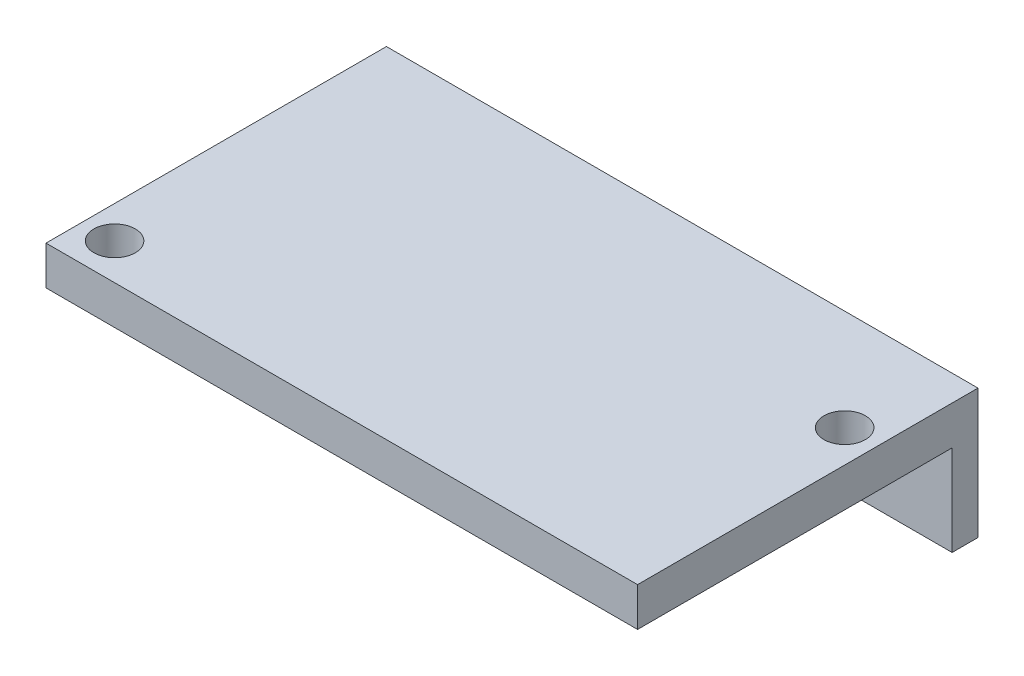
ISO-10303-21;
HEADER;
FILE_DESCRIPTION(('STEP AP214'),'2;1');
FILE_NAME('part.step','',(''),(''),'','','');
FILE_SCHEMA(('AUTOMOTIVE_DESIGN { 1 0 10303 214 1 1 1 1 }'));
ENDSEC;
DATA;
#1=APPLICATION_CONTEXT('core data for automotive mechanical design processes');
#2=APPLICATION_PROTOCOL_DEFINITION('international standard','automotive_design',2000,#1);
#3=PRODUCT_CONTEXT('',#1,'mechanical');
#4=PRODUCT('Part','Part','',(#3));
#5=PRODUCT_RELATED_PRODUCT_CATEGORY('part','',(#4));
#6=PRODUCT_DEFINITION_FORMATION('','',#4);
#7=PRODUCT_DEFINITION_CONTEXT('part definition',#1,'design');
#8=PRODUCT_DEFINITION('design','',#6,#7);
#9=PRODUCT_DEFINITION_SHAPE('','',#8);
#10=(LENGTH_UNIT() NAMED_UNIT(*) SI_UNIT(.MILLI.,.METRE.));
#11=(NAMED_UNIT(*) PLANE_ANGLE_UNIT() SI_UNIT($,.RADIAN.));
#12=(NAMED_UNIT(*) SI_UNIT($,.STERADIAN.) SOLID_ANGLE_UNIT());
#13=UNCERTAINTY_MEASURE_WITH_UNIT(LENGTH_MEASURE(1.E-05),#10,'distance_accuracy_value','');
#14=(GEOMETRIC_REPRESENTATION_CONTEXT(3) GLOBAL_UNCERTAINTY_ASSIGNED_CONTEXT((#13)) GLOBAL_UNIT_ASSIGNED_CONTEXT((#10,
#11,#12)) REPRESENTATION_CONTEXT('',''));
#15=CARTESIAN_POINT('',(0.,0.,0.));
#16=DIRECTION('',(0.,0.,1.));
#17=DIRECTION('',(1.,0.,0.));
#18=AXIS2_PLACEMENT_3D('',#15,#16,#17);
#19=CARTESIAN_POINT('',(22.85,3.,12.15));
#20=DIRECTION('',(-1.,0.,0.));
#21=DIRECTION('',(0.,0.,1.));
#22=AXIS2_PLACEMENT_3D('',#19,#20,#21);
#23=PLANE('',#22);
#24=DIRECTION('',(0.,0.,-1.));
#25=VECTOR('',#24,1.);
#26=CARTESIAN_POINT('',(22.85,0.,12.15));
#27=LINE('',#26,#25);
#28=CARTESIAN_POINT('',(22.85,0.,12.15));
#29=VERTEX_POINT('',#28);
#30=CARTESIAN_POINT('',(22.85,0.,-12.15));
#31=VERTEX_POINT('',#30);
#32=EDGE_CURVE('E94',#29,#31,#27,.T.);
#33=ORIENTED_EDGE('',*,*,#32,.T.);
#34=DIRECTION('',(0.,1.,0.));
#35=VECTOR('',#34,1.);
#36=CARTESIAN_POINT('',(22.85,-7.,-12.15));
#37=LINE('',#36,#35);
#38=CARTESIAN_POINT('',(22.85,-7.,-12.15));
#39=VERTEX_POINT('',#38);
#40=EDGE_CURVE('E126',#39,#31,#37,.T.);
#41=ORIENTED_EDGE('',*,*,#40,.F.);
#42=DIRECTION('',(0.,0.,-1.));
#43=VECTOR('',#42,1.);
#44=CARTESIAN_POINT('',(22.85,-7.,-14.15));
#45=LINE('',#44,#43);
#46=CARTESIAN_POINT('',(22.85,-7.,-14.15));
#47=VERTEX_POINT('',#46);
#48=EDGE_CURVE('E206',#39,#47,#45,.T.);
#49=ORIENTED_EDGE('',*,*,#48,.T.);
#50=DIRECTION('',(0.,1.,0.));
#51=VECTOR('',#50,1.);
#52=CARTESIAN_POINT('',(22.85,-7.,-14.15));
#53=LINE('',#52,#51);
#54=CARTESIAN_POINT('',(22.85,3.,-14.15));
#55=VERTEX_POINT('',#54);
#56=EDGE_CURVE('E129',#47,#55,#53,.T.);
#57=ORIENTED_EDGE('',*,*,#56,.T.);
#58=DIRECTION('',(0.,0.,-1.));
#59=VECTOR('',#58,1.);
#60=CARTESIAN_POINT('',(22.85,3.,12.15));
#61=LINE('',#60,#59);
#62=CARTESIAN_POINT('',(22.85,3.,12.15));
#63=VERTEX_POINT('',#62);
#64=EDGE_CURVE('E89',#63,#55,#61,.T.);
#65=ORIENTED_EDGE('',*,*,#64,.F.);
#66=DIRECTION('',(0.,-1.,0.));
#67=VECTOR('',#66,1.);
#68=CARTESIAN_POINT('',(22.85,3.,12.15));
#69=LINE('',#68,#67);
#70=EDGE_CURVE('E55',#63,#29,#69,.T.);
#71=ORIENTED_EDGE('',*,*,#70,.T.);
#72=EDGE_LOOP('',(#33,#41,#49,#57,#65,#71));
#73=FACE_BOUND('',#72,.T.);
#74=ADVANCED_FACE('F45',(#73),#23,.F.);
#75=CARTESIAN_POINT('',(-22.85,3.,12.15));
#76=DIRECTION('',(1.,0.,0.));
#77=DIRECTION('',(0.,0.,-1.));
#78=AXIS2_PLACEMENT_3D('',#75,#76,#77);
#79=PLANE('',#78);
#80=DIRECTION('',(0.,0.,1.));
#81=VECTOR('',#80,1.);
#82=CARTESIAN_POINT('',(-22.85,0.,12.15));
#83=LINE('',#82,#81);
#84=CARTESIAN_POINT('',(-22.85,0.,-12.15));
#85=VERTEX_POINT('',#84);
#86=CARTESIAN_POINT('',(-22.85,0.,12.15));
#87=VERTEX_POINT('',#86);
#88=EDGE_CURVE('E78',#85,#87,#83,.T.);
#89=ORIENTED_EDGE('',*,*,#88,.T.);
#90=DIRECTION('',(0.,-1.,0.));
#91=VECTOR('',#90,1.);
#92=CARTESIAN_POINT('',(-22.85,3.,12.15));
#93=LINE('',#92,#91);
#94=CARTESIAN_POINT('',(-22.85,3.,12.15));
#95=VERTEX_POINT('',#94);
#96=EDGE_CURVE('E11',#95,#87,#93,.T.);
#97=ORIENTED_EDGE('',*,*,#96,.F.);
#98=DIRECTION('',(0.,0.,1.));
#99=VECTOR('',#98,1.);
#100=CARTESIAN_POINT('',(-22.85,3.,12.15));
#101=LINE('',#100,#99);
#102=CARTESIAN_POINT('',(-22.85,3.,-14.15));
#103=VERTEX_POINT('',#102);
#104=EDGE_CURVE('E133',#103,#95,#101,.T.);
#105=ORIENTED_EDGE('',*,*,#104,.F.);
#106=DIRECTION('',(0.,1.,0.));
#107=VECTOR('',#106,1.);
#108=CARTESIAN_POINT('',(-22.85,-7.,-14.15));
#109=LINE('',#108,#107);
#110=CARTESIAN_POINT('',(-22.85,-7.,-14.15));
#111=VERTEX_POINT('',#110);
#112=EDGE_CURVE('E228',#111,#103,#109,.T.);
#113=ORIENTED_EDGE('',*,*,#112,.F.);
#114=DIRECTION('',(0.,0.,1.));
#115=VECTOR('',#114,1.);
#116=CARTESIAN_POINT('',(-22.85,-7.,-14.15));
#117=LINE('',#116,#115);
#118=CARTESIAN_POINT('',(-22.85,-7.,-12.15));
#119=VERTEX_POINT('',#118);
#120=EDGE_CURVE('E214',#111,#119,#117,.T.);
#121=ORIENTED_EDGE('',*,*,#120,.T.);
#122=DIRECTION('',(0.,1.,0.));
#123=VECTOR('',#122,1.);
#124=CARTESIAN_POINT('',(-22.85,-7.,-12.15));
#125=LINE('',#124,#123);
#126=EDGE_CURVE('E226',#119,#85,#125,.T.);
#127=ORIENTED_EDGE('',*,*,#126,.T.);
#128=EDGE_LOOP('',(#89,#97,#105,#113,#121,#127));
#129=FACE_BOUND('',#128,.T.);
#130=ADVANCED_FACE('F144',(#129),#79,.F.);
#131=CARTESIAN_POINT('',(-22.85,3.,12.15));
#132=DIRECTION('',(0.,0.,-1.));
#133=DIRECTION('',(-1.,0.,0.));
#134=AXIS2_PLACEMENT_3D('',#131,#132,#133);
#135=PLANE('',#134);
#136=DIRECTION('',(1.,0.,0.));
#137=VECTOR('',#136,1.);
#138=CARTESIAN_POINT('',(-22.85,0.,12.15));
#139=LINE('',#138,#137);
#140=EDGE_CURVE('E82',#87,#29,#139,.T.);
#141=ORIENTED_EDGE('',*,*,#140,.T.);
#142=ORIENTED_EDGE('',*,*,#70,.F.);
#143=DIRECTION('',(1.,0.,0.));
#144=VECTOR('',#143,1.);
#145=CARTESIAN_POINT('',(-22.85,3.,12.15));
#146=LINE('',#145,#144);
#147=EDGE_CURVE('E64',#95,#63,#146,.T.);
#148=ORIENTED_EDGE('',*,*,#147,.F.);
#149=ORIENTED_EDGE('',*,*,#96,.T.);
#150=EDGE_LOOP('',(#141,#142,#148,#149));
#151=FACE_BOUND('',#150,.T.);
#152=ADVANCED_FACE('F84',(#151),#135,.F.);
#153=CARTESIAN_POINT('',(0.,3.,0.));
#154=DIRECTION('',(0.,-1.,0.));
#155=DIRECTION('',(0.,0.,-1.));
#156=AXIS2_PLACEMENT_3D('',#153,#154,#155);
#157=PLANE('',#156);
#158=CARTESIAN_POINT('',(-20.35,3.,9.35));
#159=DIRECTION('',(0.,1.,0.));
#160=DIRECTION('',(0.,0.,1.));
#161=AXIS2_PLACEMENT_3D('',#158,#159,#160);
#162=CIRCLE('',#161,1.6);
#163=CARTESIAN_POINT('',(-20.35,3.,10.95));
#164=VERTEX_POINT('',#163);
#165=EDGE_CURVE('E115',#164,#164,#162,.T.);
#166=ORIENTED_EDGE('',*,*,#165,.F.);
#167=EDGE_LOOP('',(#166));
#168=FACE_BOUND('',#167,.T.);
#169=CARTESIAN_POINT('',(20.35,3.,-6.35));
#170=DIRECTION('',(0.,1.,0.));
#171=DIRECTION('',(0.,0.,1.));
#172=AXIS2_PLACEMENT_3D('',#169,#170,#171);
#173=CIRCLE('',#172,1.6);
#174=CARTESIAN_POINT('',(20.35,3.,-4.75));
#175=VERTEX_POINT('',#174);
#176=EDGE_CURVE('E120',#175,#175,#173,.T.);
#177=ORIENTED_EDGE('',*,*,#176,.F.);
#178=EDGE_LOOP('',(#177));
#179=FACE_BOUND('',#178,.T.);
#180=ORIENTED_EDGE('',*,*,#64,.T.);
#181=DIRECTION('',(-1.,0.,0.));
#182=VECTOR('',#181,1.);
#183=CARTESIAN_POINT('',(-22.85,3.,-14.15));
#184=LINE('',#183,#182);
#185=EDGE_CURVE('E141',#55,#103,#184,.T.);
#186=ORIENTED_EDGE('',*,*,#185,.T.);
#187=ORIENTED_EDGE('',*,*,#104,.T.);
#188=ORIENTED_EDGE('',*,*,#147,.T.);
#189=EDGE_LOOP('',(#180,#186,#187,#188));
#190=FACE_BOUND('',#189,.T.);
#191=ADVANCED_FACE('F138',(#168,#179,#190),#157,.F.);
#192=CARTESIAN_POINT('',(0.,0.,0.));
#193=DIRECTION('',(0.,-1.,0.));
#194=DIRECTION('',(0.,0.,-1.));
#195=AXIS2_PLACEMENT_3D('',#192,#193,#194);
#196=PLANE('',#195);
#197=CARTESIAN_POINT('',(-20.35,0.,9.35));
#198=DIRECTION('',(0.,-1.,0.));
#199=DIRECTION('',(0.,0.,-1.));
#200=AXIS2_PLACEMENT_3D('',#197,#198,#199);
#201=CIRCLE('',#200,1.6);
#202=CARTESIAN_POINT('',(-20.35,0.,7.75));
#203=VERTEX_POINT('',#202);
#204=EDGE_CURVE('E48',#203,#203,#201,.T.);
#205=ORIENTED_EDGE('',*,*,#204,.F.);
#206=EDGE_LOOP('',(#205));
#207=FACE_BOUND('',#206,.T.);
#208=CARTESIAN_POINT('',(20.35,0.,-6.35));
#209=DIRECTION('',(0.,-1.,0.));
#210=DIRECTION('',(0.,0.,-1.));
#211=AXIS2_PLACEMENT_3D('',#208,#209,#210);
#212=CIRCLE('',#211,1.6);
#213=CARTESIAN_POINT('',(20.35,0.,-7.95));
#214=VERTEX_POINT('',#213);
#215=EDGE_CURVE('E108',#214,#214,#212,.T.);
#216=ORIENTED_EDGE('',*,*,#215,.F.);
#217=EDGE_LOOP('',(#216));
#218=FACE_BOUND('',#217,.T.);
#219=ORIENTED_EDGE('',*,*,#32,.F.);
#220=ORIENTED_EDGE('',*,*,#140,.F.);
#221=ORIENTED_EDGE('',*,*,#88,.F.);
#222=DIRECTION('',(-1.,0.,0.));
#223=VECTOR('',#222,1.);
#224=CARTESIAN_POINT('',(-22.85,0.,-12.15));
#225=LINE('',#224,#223);
#226=EDGE_CURVE('E101',#31,#85,#225,.T.);
#227=ORIENTED_EDGE('',*,*,#226,.F.);
#228=EDGE_LOOP('',(#219,#220,#221,#227));
#229=FACE_BOUND('',#228,.T.);
#230=ADVANCED_FACE('F99',(#207,#218,#229),#196,.T.);
#231=CARTESIAN_POINT('',(20.35,-18.8,-6.35));
#232=DIRECTION('',(0.,1.,0.));
#233=DIRECTION('',(0.,0.,1.));
#234=AXIS2_PLACEMENT_3D('',#231,#232,#233);
#235=CYLINDRICAL_SURFACE('',#234,1.6);
#236=ORIENTED_EDGE('',*,*,#215,.T.);
#237=EDGE_LOOP('',(#236));
#238=FACE_BOUND('',#237,.T.);
#239=ORIENTED_EDGE('',*,*,#176,.T.);
#240=EDGE_LOOP('',(#239));
#241=FACE_BOUND('',#240,.T.);
#242=ADVANCED_FACE('F155',(#238,#241),#235,.F.);
#243=CARTESIAN_POINT('',(-20.35,-18.8,9.35));
#244=DIRECTION('',(0.,1.,0.));
#245=DIRECTION('',(0.,0.,1.));
#246=AXIS2_PLACEMENT_3D('',#243,#244,#245);
#247=CYLINDRICAL_SURFACE('',#246,1.6);
#248=ORIENTED_EDGE('',*,*,#204,.T.);
#249=EDGE_LOOP('',(#248));
#250=FACE_BOUND('',#249,.T.);
#251=ORIENTED_EDGE('',*,*,#165,.T.);
#252=EDGE_LOOP('',(#251));
#253=FACE_BOUND('',#252,.T.);
#254=ADVANCED_FACE('F161',(#250,#253),#247,.F.);
#255=CARTESIAN_POINT('',(-22.85,-7.,-12.15));
#256=DIRECTION('',(0.,0.,1.));
#257=DIRECTION('',(1.,0.,0.));
#258=AXIS2_PLACEMENT_3D('',#255,#256,#257);
#259=PLANE('',#258);
#260=CARTESIAN_POINT('',(12.85,-4.,-12.15));
#261=DIRECTION('',(0.,0.,1.));
#262=DIRECTION('',(1.,0.,0.));
#263=AXIS2_PLACEMENT_3D('',#260,#261,#262);
#264=CIRCLE('',#263,1.6);
#265=CARTESIAN_POINT('',(14.45,-4.,-12.15));
#266=VERTEX_POINT('',#265);
#267=EDGE_CURVE('E189',#266,#266,#264,.T.);
#268=ORIENTED_EDGE('',*,*,#267,.F.);
#269=EDGE_LOOP('',(#268));
#270=FACE_BOUND('',#269,.T.);
#271=CARTESIAN_POINT('',(-12.85,-4.,-12.15));
#272=DIRECTION('',(0.,0.,1.));
#273=DIRECTION('',(1.,0.,0.));
#274=AXIS2_PLACEMENT_3D('',#271,#272,#273);
#275=CIRCLE('',#274,1.6);
#276=CARTESIAN_POINT('',(-11.25,-4.,-12.15));
#277=VERTEX_POINT('',#276);
#278=EDGE_CURVE('E194',#277,#277,#275,.T.);
#279=ORIENTED_EDGE('',*,*,#278,.F.);
#280=EDGE_LOOP('',(#279));
#281=FACE_BOUND('',#280,.T.);
#282=ORIENTED_EDGE('',*,*,#40,.T.);
#283=ORIENTED_EDGE('',*,*,#226,.T.);
#284=ORIENTED_EDGE('',*,*,#126,.F.);
#285=DIRECTION('',(1.,0.,0.));
#286=VECTOR('',#285,1.);
#287=CARTESIAN_POINT('',(-22.85,-7.,-12.15));
#288=LINE('',#287,#286);
#289=EDGE_CURVE('E218',#119,#39,#288,.T.);
#290=ORIENTED_EDGE('',*,*,#289,.T.);
#291=EDGE_LOOP('',(#282,#283,#284,#290));
#292=FACE_BOUND('',#291,.T.);
#293=ADVANCED_FACE('F164',(#270,#281,#292),#259,.T.);
#294=CARTESIAN_POINT('',(-22.85,-7.,-14.15));
#295=DIRECTION('',(0.,0.,-1.));
#296=DIRECTION('',(-1.,0.,0.));
#297=AXIS2_PLACEMENT_3D('',#294,#295,#296);
#298=PLANE('',#297);
#299=CARTESIAN_POINT('',(12.85,-4.,-14.15));
#300=DIRECTION('',(0.,0.,-1.));
#301=DIRECTION('',(-1.,0.,0.));
#302=AXIS2_PLACEMENT_3D('',#299,#300,#301);
#303=CIRCLE('',#302,1.6);
#304=CARTESIAN_POINT('',(11.25,-4.,-14.15));
#305=VERTEX_POINT('',#304);
#306=EDGE_CURVE('E192',#305,#305,#303,.T.);
#307=ORIENTED_EDGE('',*,*,#306,.F.);
#308=EDGE_LOOP('',(#307));
#309=FACE_BOUND('',#308,.T.);
#310=CARTESIAN_POINT('',(-12.85,-4.,-14.15));
#311=DIRECTION('',(0.,0.,-1.));
#312=DIRECTION('',(-1.,0.,0.));
#313=AXIS2_PLACEMENT_3D('',#310,#311,#312);
#314=CIRCLE('',#313,1.6);
#315=CARTESIAN_POINT('',(-14.45,-4.,-14.15));
#316=VERTEX_POINT('',#315);
#317=EDGE_CURVE('E195',#316,#316,#314,.T.);
#318=ORIENTED_EDGE('',*,*,#317,.F.);
#319=EDGE_LOOP('',(#318));
#320=FACE_BOUND('',#319,.T.);
#321=ORIENTED_EDGE('',*,*,#185,.F.);
#322=ORIENTED_EDGE('',*,*,#56,.F.);
#323=DIRECTION('',(-1.,0.,0.));
#324=VECTOR('',#323,1.);
#325=CARTESIAN_POINT('',(-22.85,-7.,-14.15));
#326=LINE('',#325,#324);
#327=EDGE_CURVE('E210',#47,#111,#326,.T.);
#328=ORIENTED_EDGE('',*,*,#327,.T.);
#329=ORIENTED_EDGE('',*,*,#112,.T.);
#330=EDGE_LOOP('',(#321,#322,#328,#329));
#331=FACE_BOUND('',#330,.T.);
#332=ADVANCED_FACE('F166',(#309,#320,#331),#298,.T.);
#333=CARTESIAN_POINT('',(0.,-7.,0.));
#334=DIRECTION('',(0.,1.,0.));
#335=DIRECTION('',(0.,0.,1.));
#336=AXIS2_PLACEMENT_3D('',#333,#334,#335);
#337=PLANE('',#336);
#338=ORIENTED_EDGE('',*,*,#48,.F.);
#339=ORIENTED_EDGE('',*,*,#289,.F.);
#340=ORIENTED_EDGE('',*,*,#120,.F.);
#341=ORIENTED_EDGE('',*,*,#327,.F.);
#342=EDGE_LOOP('',(#338,#339,#340,#341));
#343=FACE_BOUND('',#342,.T.);
#344=ADVANCED_FACE('F169',(#343),#337,.F.);
#345=CARTESIAN_POINT('',(-12.85,-4.,-10.15));
#346=DIRECTION('',(0.,0.,-1.));
#347=DIRECTION('',(-1.,0.,0.));
#348=AXIS2_PLACEMENT_3D('',#345,#346,#347);
#349=CYLINDRICAL_SURFACE('',#348,1.6);
#350=ORIENTED_EDGE('',*,*,#278,.T.);
#351=EDGE_LOOP('',(#350));
#352=FACE_BOUND('',#351,.T.);
#353=ORIENTED_EDGE('',*,*,#317,.T.);
#354=EDGE_LOOP('',(#353));
#355=FACE_BOUND('',#354,.T.);
#356=ADVANCED_FACE('F176',(#352,#355),#349,.F.);
#357=CARTESIAN_POINT('',(12.85,-4.,-10.15));
#358=DIRECTION('',(0.,0.,-1.));
#359=DIRECTION('',(-1.,0.,0.));
#360=AXIS2_PLACEMENT_3D('',#357,#358,#359);
#361=CYLINDRICAL_SURFACE('',#360,1.6);
#362=ORIENTED_EDGE('',*,*,#267,.T.);
#363=EDGE_LOOP('',(#362));
#364=FACE_BOUND('',#363,.T.);
#365=ORIENTED_EDGE('',*,*,#306,.T.);
#366=EDGE_LOOP('',(#365));
#367=FACE_BOUND('',#366,.T.);
#368=ADVANCED_FACE('F180',(#364,#367),#361,.F.);
#369=CLOSED_SHELL('',(#74,#130,#152,#191,#230,#242,#254,#293,#332,#344,#356,#368));
#370=MANIFOLD_SOLID_BREP('B2',#369);
#371=ADVANCED_BREP_SHAPE_REPRESENTATION('',(#18,#370),#14);
#372=SHAPE_DEFINITION_REPRESENTATION(#9,#371);
ENDSEC;
END-ISO-10303-21;
